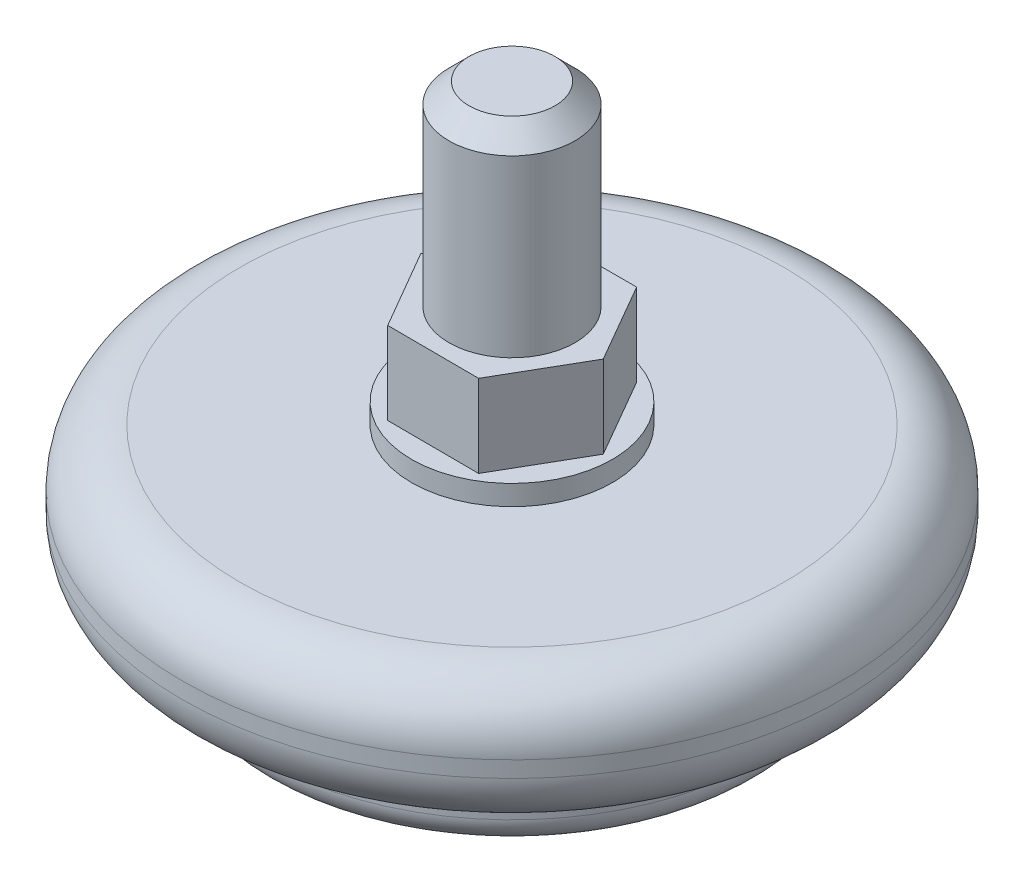
ISO-10303-21;
HEADER;
FILE_DESCRIPTION(('STEP AP214'),'2;1');
FILE_NAME('part.step','',(''),(''),'','','');
FILE_SCHEMA(('AUTOMOTIVE_DESIGN { 1 0 10303 214 1 1 1 1 }'));
ENDSEC;
DATA;
#1=APPLICATION_CONTEXT('core data for automotive mechanical design processes');
#2=APPLICATION_PROTOCOL_DEFINITION('international standard','automotive_design',2000,#1);
#3=PRODUCT_CONTEXT('',#1,'mechanical');
#4=PRODUCT('Part','Part','',(#3));
#5=PRODUCT_RELATED_PRODUCT_CATEGORY('part','',(#4));
#6=PRODUCT_DEFINITION_FORMATION('','',#4);
#7=PRODUCT_DEFINITION_CONTEXT('part definition',#1,'design');
#8=PRODUCT_DEFINITION('design','',#6,#7);
#9=PRODUCT_DEFINITION_SHAPE('','',#8);
#10=(LENGTH_UNIT() NAMED_UNIT(*) SI_UNIT(.MILLI.,.METRE.));
#11=(NAMED_UNIT(*) PLANE_ANGLE_UNIT() SI_UNIT($,.RADIAN.));
#12=(NAMED_UNIT(*) SI_UNIT($,.STERADIAN.) SOLID_ANGLE_UNIT());
#13=UNCERTAINTY_MEASURE_WITH_UNIT(LENGTH_MEASURE(1.E-05),#10,'distance_accuracy_value','');
#14=(GEOMETRIC_REPRESENTATION_CONTEXT(3) GLOBAL_UNCERTAINTY_ASSIGNED_CONTEXT((#13)) GLOBAL_UNIT_ASSIGNED_CONTEXT((#10,
#11,#12)) REPRESENTATION_CONTEXT('',''));
#15=CARTESIAN_POINT('',(0.,0.,0.));
#16=DIRECTION('',(0.,0.,1.));
#17=DIRECTION('',(1.,0.,0.));
#18=AXIS2_PLACEMENT_3D('',#15,#16,#17);
#19=CARTESIAN_POINT('',(26.1069531141512,-14.097,0.));
#20=DIRECTION('',(0.,1.,0.));
#21=DIRECTION('',(0.,0.,1.));
#22=AXIS2_PLACEMENT_3D('',#19,#20,#21);
#23=TOROIDAL_SURFACE('',#22,16.7332577265497,2.03199999999996);
#24=CARTESIAN_POINT('',(26.1069531141512,-16.129,0.));
#25=DIRECTION('',(0.,1.,0.));
#26=DIRECTION('',(0.,0.,1.));
#27=AXIS2_PLACEMENT_3D('',#24,#25,#26);
#28=CIRCLE('',#27,16.7332577265497);
#29=CARTESIAN_POINT('',(26.1069531141512,-16.129,16.7332577265497));
#30=VERTEX_POINT('',#29);
#31=EDGE_CURVE('E13',#30,#30,#28,.T.);
#32=ORIENTED_EDGE('',*,*,#31,.T.);
#33=EDGE_LOOP('',(#32));
#34=FACE_BOUND('',#33,.T.);
#35=CARTESIAN_POINT('',(26.1069531141512,-14.097,0.));
#36=DIRECTION('',(0.,1.,0.));
#37=DIRECTION('',(0.,0.,1.));
#38=AXIS2_PLACEMENT_3D('',#35,#36,#37);
#39=CIRCLE('',#38,18.7652577265496);
#40=CARTESIAN_POINT('',(26.1069531141512,-14.097,18.7652577265496));
#41=VERTEX_POINT('',#40);
#42=EDGE_CURVE('E184',#41,#41,#39,.T.);
#43=ORIENTED_EDGE('',*,*,#42,.F.);
#44=EDGE_LOOP('',(#43));
#45=FACE_BOUND('',#44,.T.);
#46=ADVANCED_FACE('F77',(#34,#45),#23,.T.);
#47=CARTESIAN_POINT('',(9.37369538760147,-16.129,0.));
#48=DIRECTION('',(0.,-1.,0.));
#49=DIRECTION('',(0.,0.,-1.));
#50=AXIS2_PLACEMENT_3D('',#47,#48,#49);
#51=PLANE('',#50);
#52=ORIENTED_EDGE('',*,*,#31,.F.);
#53=EDGE_LOOP('',(#52));
#54=FACE_BOUND('',#53,.T.);
#55=ADVANCED_FACE('F249',(#54),#51,.T.);
#56=CARTESIAN_POINT('',(18.5253048492068,0.,0.));
#57=DIRECTION('',(0.,1.,0.));
#58=DIRECTION('',(0.,0.,1.));
#59=AXIS2_PLACEMENT_3D('',#56,#57,#58);
#60=PLANE('',#59);
#61=CARTESIAN_POINT('',(26.1069531141512,0.,0.));
#62=DIRECTION('',(0.,1.,0.));
#63=DIRECTION('',(0.,0.,1.));
#64=AXIS2_PLACEMENT_3D('',#61,#62,#63);
#65=CIRCLE('',#64,7.5816482649444);
#66=CARTESIAN_POINT('',(26.1069531141512,0.,7.5816482649444));
#67=VERTEX_POINT('',#66);
#68=EDGE_CURVE('E216',#67,#67,#65,.T.);
#69=ORIENTED_EDGE('',*,*,#68,.T.);
#70=EDGE_LOOP('',(#69));
#71=FACE_BOUND('',#70,.T.);
#72=DIRECTION('',(0.501929063563417,0.,0.864908790075781));
#73=VECTOR('',#72,1.);
#74=CARTESIAN_POINT('',(17.0952088213918,0.,-3.6519762303156));
#75=LINE('',#74,#73);
#76=CARTESIAN_POINT('',(19.2145456005653,0.,1.90819582357449E-13));
#77=VERTEX_POINT('',#76);
#78=CARTESIAN_POINT('',(22.6607493573581,0.,5.93839276905226));
#79=VERTEX_POINT('',#78);
#80=EDGE_CURVE('E181',#77,#79,#75,.T.);
#81=ORIENTED_EDGE('',*,*,#80,.F.);
#82=DIRECTION('',(-0.499999999999979,0.,0.866025403784451));
#83=VECTOR('',#82,1.);
#84=CARTESIAN_POINT('',(17.1114680074306,0.,3.64263724356946));
#85=LINE('',#84,#83);
#86=CARTESIAN_POINT('',(22.6607493573584,0.,-5.969));
#87=VERTEX_POINT('',#86);
#88=EDGE_CURVE('E185',#87,#77,#85,.T.);
#89=ORIENTED_EDGE('',*,*,#88,.F.);
#90=DIRECTION('',(-1.,0.,0.));
#91=VECTOR('',#90,1.);
#92=CARTESIAN_POINT('',(10.8022352280253,0.,-5.969));
#93=LINE('',#92,#91);
#94=CARTESIAN_POINT('',(29.553156870944,0.,-5.969));
#95=VERTEX_POINT('',#94);
#96=EDGE_CURVE('E178',#95,#87,#93,.T.);
#97=ORIENTED_EDGE('',*,*,#96,.F.);
#98=DIRECTION('',(-0.499999999999979,0.,-0.866025403784451));
#99=VECTOR('',#98,1.);
#100=CARTESIAN_POINT('',(27.4500792778095,0.,-9.61163724356927));
#101=LINE('',#100,#99);
#102=CARTESIAN_POINT('',(32.9993606277369,0.,0.));
#103=VERTEX_POINT('',#102);
#104=EDGE_CURVE('E157',#103,#95,#101,.T.);
#105=ORIENTED_EDGE('',*,*,#104,.F.);
#106=DIRECTION('',(-0.499999999999987,0.,0.866025403784446));
#107=VECTOR('',#106,1.);
#108=CARTESIAN_POINT('',(27.4500792778093,0.,9.61163724356937));
#109=LINE('',#108,#107);
#110=CARTESIAN_POINT('',(29.5531568709442,0.,5.96899999999987));
#111=VERTEX_POINT('',#110);
#112=EDGE_CURVE('E154',#103,#111,#109,.T.);
#113=ORIENTED_EDGE('',*,*,#112,.T.);
#114=DIRECTION('',(-0.999990140162263,0.,-0.00444067317623687));
#115=VECTOR('',#114,1.);
#116=CARTESIAN_POINT('',(10.7760988714517,0.,5.88561640006411));
#117=LINE('',#116,#115);
#118=EDGE_CURVE('E141',#111,#79,#117,.T.);
#119=ORIENTED_EDGE('',*,*,#118,.T.);
#120=EDGE_LOOP('',(#81,#89,#97,#105,#113,#119));
#121=FACE_BOUND('',#120,.T.);
#122=ADVANCED_FACE('F155',(#71,#121),#60,.T.);
#123=CARTESIAN_POINT('',(26.1069531141512,20.955,0.));
#124=DIRECTION('',(0.,1.,0.));
#125=DIRECTION('',(0.,0.,1.));
#126=AXIS2_PLACEMENT_3D('',#123,#124,#125);
#127=CYLINDRICAL_SURFACE('',#126,7.5816482649444);
#128=CARTESIAN_POINT('',(26.1069531141512,-1.524,0.));
#129=DIRECTION('',(0.,1.,0.));
#130=DIRECTION('',(0.,0.,1.));
#131=AXIS2_PLACEMENT_3D('',#128,#129,#130);
#132=CIRCLE('',#131,7.5816482649444);
#133=CARTESIAN_POINT('',(26.1069531141512,-1.524,7.5816482649444));
#134=VERTEX_POINT('',#133);
#135=EDGE_CURVE('E212',#134,#134,#132,.T.);
#136=ORIENTED_EDGE('',*,*,#135,.T.);
#137=EDGE_LOOP('',(#136));
#138=FACE_BOUND('',#137,.T.);
#139=ORIENTED_EDGE('',*,*,#68,.F.);
#140=EDGE_LOOP('',(#139));
#141=FACE_BOUND('',#140,.T.);
#142=ADVANCED_FACE('F293',(#138,#141),#127,.T.);
#143=CARTESIAN_POINT('',(5.53295311415114,-1.524,0.));
#144=DIRECTION('',(0.,1.,0.));
#145=DIRECTION('',(0.,0.,1.));
#146=AXIS2_PLACEMENT_3D('',#143,#144,#145);
#147=PLANE('',#146);
#148=CARTESIAN_POINT('',(26.1069531141512,-1.524,0.));
#149=DIRECTION('',(0.,1.,0.));
#150=DIRECTION('',(0.,0.,1.));
#151=AXIS2_PLACEMENT_3D('',#148,#149,#150);
#152=CIRCLE('',#151,20.574);
#153=CARTESIAN_POINT('',(26.1069531141512,-1.524,20.574));
#154=VERTEX_POINT('',#153);
#155=EDGE_CURVE('E208',#154,#154,#152,.T.);
#156=ORIENTED_EDGE('',*,*,#155,.T.);
#157=EDGE_LOOP('',(#156));
#158=FACE_BOUND('',#157,.T.);
#159=ORIENTED_EDGE('',*,*,#135,.F.);
#160=EDGE_LOOP('',(#159));
#161=FACE_BOUND('',#160,.T.);
#162=ADVANCED_FACE('F287',(#158,#161),#147,.T.);
#163=CARTESIAN_POINT('',(26.1069531141512,-5.84199999999999,0.));
#164=DIRECTION('',(0.,1.,0.));
#165=DIRECTION('',(0.,0.,1.));
#166=AXIS2_PLACEMENT_3D('',#163,#164,#165);
#167=TOROIDAL_SURFACE('',#166,20.574,4.31800000000004);
#168=CARTESIAN_POINT('',(26.1069531141512,-5.84199999999999,0.));
#169=DIRECTION('',(0.,1.,0.));
#170=DIRECTION('',(0.,0.,1.));
#171=AXIS2_PLACEMENT_3D('',#168,#169,#170);
#172=CIRCLE('',#171,24.8920000000001);
#173=CARTESIAN_POINT('',(26.1069531141512,-5.84199999999999,24.8920000000001));
#174=VERTEX_POINT('',#173);
#175=EDGE_CURVE('E204',#174,#174,#172,.T.);
#176=ORIENTED_EDGE('',*,*,#175,.T.);
#177=EDGE_LOOP('',(#176));
#178=FACE_BOUND('',#177,.T.);
#179=ORIENTED_EDGE('',*,*,#155,.F.);
#180=EDGE_LOOP('',(#179));
#181=FACE_BOUND('',#180,.T.);
#182=ADVANCED_FACE('F281',(#178,#181),#167,.T.);
#183=CARTESIAN_POINT('',(26.1069531141512,20.955,0.));
#184=DIRECTION('',(0.,1.,0.));
#185=DIRECTION('',(0.,0.,1.));
#186=AXIS2_PLACEMENT_3D('',#183,#184,#185);
#187=CYLINDRICAL_SURFACE('',#186,24.8920000000001);
#188=CARTESIAN_POINT('',(26.1069531141512,-7.06119999999999,0.));
#189=DIRECTION('',(0.,1.,0.));
#190=DIRECTION('',(0.,0.,1.));
#191=AXIS2_PLACEMENT_3D('',#188,#189,#190);
#192=CIRCLE('',#191,24.8920000000001);
#193=CARTESIAN_POINT('',(26.1069531141512,-7.06119999999999,24.8920000000001));
#194=VERTEX_POINT('',#193);
#195=EDGE_CURVE('E200',#194,#194,#192,.T.);
#196=ORIENTED_EDGE('',*,*,#195,.T.);
#197=EDGE_LOOP('',(#196));
#198=FACE_BOUND('',#197,.T.);
#199=ORIENTED_EDGE('',*,*,#175,.F.);
#200=EDGE_LOOP('',(#199));
#201=FACE_BOUND('',#200,.T.);
#202=ADVANCED_FACE('F275',(#198,#201),#187,.T.);
#203=CARTESIAN_POINT('',(26.1069531141512,-7.06119999999999,0.));
#204=DIRECTION('',(0.,1.,0.));
#205=DIRECTION('',(0.,0.,1.));
#206=AXIS2_PLACEMENT_3D('',#203,#204,#205);
#207=TOROIDAL_SURFACE('',#206,20.574,4.31800000000005);
#208=CARTESIAN_POINT('',(26.1069531141512,-11.3792,0.));
#209=DIRECTION('',(0.,1.,0.));
#210=DIRECTION('',(0.,0.,1.));
#211=AXIS2_PLACEMENT_3D('',#208,#209,#210);
#212=CIRCLE('',#211,20.574);
#213=CARTESIAN_POINT('',(26.1069531141512,-11.3792,20.574));
#214=VERTEX_POINT('',#213);
#215=EDGE_CURVE('E196',#214,#214,#212,.T.);
#216=ORIENTED_EDGE('',*,*,#215,.T.);
#217=EDGE_LOOP('',(#216));
#218=FACE_BOUND('',#217,.T.);
#219=ORIENTED_EDGE('',*,*,#195,.F.);
#220=EDGE_LOOP('',(#219));
#221=FACE_BOUND('',#220,.T.);
#222=ADVANCED_FACE('F269',(#218,#221),#207,.T.);
#223=CARTESIAN_POINT('',(5.53295311415114,-11.3792,0.));
#224=DIRECTION('',(0.,-1.,0.));
#225=DIRECTION('',(0.,0.,-1.));
#226=AXIS2_PLACEMENT_3D('',#223,#224,#225);
#227=PLANE('',#226);
#228=CARTESIAN_POINT('',(26.1069531141512,-11.3792,0.));
#229=DIRECTION('',(0.,1.,0.));
#230=DIRECTION('',(0.,0.,1.));
#231=AXIS2_PLACEMENT_3D('',#228,#229,#230);
#232=CIRCLE('',#231,18.7652577265497);
#233=CARTESIAN_POINT('',(26.1069531141512,-11.3792,18.7652577265497));
#234=VERTEX_POINT('',#233);
#235=EDGE_CURVE('E192',#234,#234,#232,.T.);
#236=ORIENTED_EDGE('',*,*,#235,.T.);
#237=EDGE_LOOP('',(#236));
#238=FACE_BOUND('',#237,.T.);
#239=ORIENTED_EDGE('',*,*,#215,.F.);
#240=EDGE_LOOP('',(#239));
#241=FACE_BOUND('',#240,.T.);
#242=ADVANCED_FACE('F263',(#238,#241),#227,.T.);
#243=CARTESIAN_POINT('',(26.1069531141512,20.955,0.));
#244=DIRECTION('',(0.,1.,0.));
#245=DIRECTION('',(0.,0.,1.));
#246=AXIS2_PLACEMENT_3D('',#243,#244,#245);
#247=CYLINDRICAL_SURFACE('',#246,18.7652577265497);
#248=ORIENTED_EDGE('',*,*,#42,.T.);
#249=EDGE_LOOP('',(#248));
#250=FACE_BOUND('',#249,.T.);
#251=ORIENTED_EDGE('',*,*,#235,.F.);
#252=EDGE_LOOP('',(#251));
#253=FACE_BOUND('',#252,.T.);
#254=ADVANCED_FACE('F259',(#250,#253),#247,.T.);
#255=CARTESIAN_POINT('',(27.4500792778095,-71.1092600690744,-9.61163724356927));
#256=DIRECTION('',(-0.866025403784451,0.,0.499999999999979));
#257=DIRECTION('',(0.499999999999979,0.,0.866025403784451));
#258=AXIS2_PLACEMENT_3D('',#255,#256,#257);
#259=PLANE('',#258);
#260=ORIENTED_EDGE('',*,*,#104,.T.);
#261=DIRECTION('',(0.,1.,0.));
#262=VECTOR('',#261,1.);
#263=CARTESIAN_POINT('',(29.553156870944,-71.1092600690744,-5.969));
#264=LINE('',#263,#262);
#265=CARTESIAN_POINT('',(29.553156870944,6.22300000000001,-5.969));
#266=VERTEX_POINT('',#265);
#267=EDGE_CURVE('E179',#95,#266,#264,.T.);
#268=ORIENTED_EDGE('',*,*,#267,.T.);
#269=DIRECTION('',(0.499999999999979,0.,0.866025403784451));
#270=VECTOR('',#269,1.);
#271=CARTESIAN_POINT('',(27.4500792778095,6.22300000000001,-9.61163724356927));
#272=LINE('',#271,#270);
#273=CARTESIAN_POINT('',(32.9993606277369,6.22300000000001,0.));
#274=VERTEX_POINT('',#273);
#275=EDGE_CURVE('E315',#266,#274,#272,.T.);
#276=ORIENTED_EDGE('',*,*,#275,.T.);
#277=DIRECTION('',(0.,1.,0.));
#278=VECTOR('',#277,1.);
#279=CARTESIAN_POINT('',(32.9993606277369,-71.1092600690744,0.));
#280=LINE('',#279,#278);
#281=EDGE_CURVE('E161',#103,#274,#280,.T.);
#282=ORIENTED_EDGE('',*,*,#281,.F.);
#283=EDGE_LOOP('',(#260,#268,#276,#282));
#284=FACE_BOUND('',#283,.T.);
#285=ADVANCED_FACE('F262',(#284),#259,.F.);
#286=CARTESIAN_POINT('',(27.4500792778093,-71.1092600690744,9.61163724356937));
#287=DIRECTION('',(0.866025403784446,0.,0.499999999999987));
#288=DIRECTION('',(0.499999999999987,0.,-0.866025403784446));
#289=AXIS2_PLACEMENT_3D('',#286,#287,#288);
#290=PLANE('',#289);
#291=ORIENTED_EDGE('',*,*,#281,.T.);
#292=DIRECTION('',(0.499999999999987,0.,-0.866025403784446));
#293=VECTOR('',#292,1.);
#294=CARTESIAN_POINT('',(27.4500792778093,6.22300000000001,9.61163724356937));
#295=LINE('',#294,#293);
#296=CARTESIAN_POINT('',(29.5531568709442,6.22300000000001,5.96899999999987));
#297=VERTEX_POINT('',#296);
#298=EDGE_CURVE('E151',#297,#274,#295,.T.);
#299=ORIENTED_EDGE('',*,*,#298,.F.);
#300=DIRECTION('',(0.,1.,0.));
#301=VECTOR('',#300,1.);
#302=CARTESIAN_POINT('',(29.5531568709442,-71.1092600690744,5.96899999999987));
#303=LINE('',#302,#301);
#304=EDGE_CURVE('E146',#111,#297,#303,.T.);
#305=ORIENTED_EDGE('',*,*,#304,.F.);
#306=ORIENTED_EDGE('',*,*,#112,.F.);
#307=EDGE_LOOP('',(#291,#299,#305,#306));
#308=FACE_BOUND('',#307,.T.);
#309=ADVANCED_FACE('F163',(#308),#290,.T.);
#310=CARTESIAN_POINT('',(10.7760988714517,-71.1092600690744,5.88561640006411));
#311=DIRECTION('',(-0.00444067317623687,0.,0.999990140162263));
#312=DIRECTION('',(0.999990140162263,0.,0.00444067317623687));
#313=AXIS2_PLACEMENT_3D('',#310,#311,#312);
#314=PLANE('',#313);
#315=ORIENTED_EDGE('',*,*,#304,.T.);
#316=DIRECTION('',(0.999990140162263,0.,0.00444067317623687));
#317=VECTOR('',#316,1.);
#318=CARTESIAN_POINT('',(10.7760988714517,6.22300000000001,5.88561640006411));
#319=LINE('',#318,#317);
#320=CARTESIAN_POINT('',(22.6607493573581,6.22300000000001,5.93839276905226));
#321=VERTEX_POINT('',#320);
#322=EDGE_CURVE('E334',#321,#297,#319,.T.);
#323=ORIENTED_EDGE('',*,*,#322,.F.);
#324=DIRECTION('',(0.,1.,0.));
#325=VECTOR('',#324,1.);
#326=CARTESIAN_POINT('',(22.6607493573581,-71.1092600690744,5.93839276905226));
#327=LINE('',#326,#325);
#328=EDGE_CURVE('E148',#79,#321,#327,.T.);
#329=ORIENTED_EDGE('',*,*,#328,.F.);
#330=ORIENTED_EDGE('',*,*,#118,.F.);
#331=EDGE_LOOP('',(#315,#323,#329,#330));
#332=FACE_BOUND('',#331,.T.);
#333=ADVANCED_FACE('F143',(#332),#314,.T.);
#334=CARTESIAN_POINT('',(17.0952088213918,-71.1092600690744,-3.6519762303156));
#335=DIRECTION('',(0.864908790075781,0.,-0.501929063563417));
#336=DIRECTION('',(-0.501929063563417,0.,-0.864908790075781));
#337=AXIS2_PLACEMENT_3D('',#334,#335,#336);
#338=PLANE('',#337);
#339=ORIENTED_EDGE('',*,*,#80,.T.);
#340=ORIENTED_EDGE('',*,*,#328,.T.);
#341=DIRECTION('',(-0.501929063563417,0.,-0.864908790075781));
#342=VECTOR('',#341,1.);
#343=CARTESIAN_POINT('',(17.0952088213918,6.22300000000001,-3.6519762303156));
#344=LINE('',#343,#342);
#345=CARTESIAN_POINT('',(19.2145456005655,6.22300000000001,0.));
#346=VERTEX_POINT('',#345);
#347=EDGE_CURVE('E323',#321,#346,#344,.T.);
#348=ORIENTED_EDGE('',*,*,#347,.T.);
#349=DIRECTION('',(0.,1.,0.));
#350=VECTOR('',#349,1.);
#351=CARTESIAN_POINT('',(19.2145456005655,-71.1092600690744,0.));
#352=LINE('',#351,#350);
#353=EDGE_CURVE('E104',#77,#346,#352,.T.);
#354=ORIENTED_EDGE('',*,*,#353,.F.);
#355=EDGE_LOOP('',(#339,#340,#348,#354));
#356=FACE_BOUND('',#355,.T.);
#357=ADVANCED_FACE('F346',(#356),#338,.F.);
#358=CARTESIAN_POINT('',(17.1114680074306,-71.1092600690744,3.64263724356946));
#359=DIRECTION('',(0.866025403784451,0.,0.499999999999979));
#360=DIRECTION('',(0.499999999999979,0.,-0.866025403784451));
#361=AXIS2_PLACEMENT_3D('',#358,#359,#360);
#362=PLANE('',#361);
#363=ORIENTED_EDGE('',*,*,#88,.T.);
#364=ORIENTED_EDGE('',*,*,#353,.T.);
#365=DIRECTION('',(0.499999999999979,0.,-0.866025403784451));
#366=VECTOR('',#365,1.);
#367=CARTESIAN_POINT('',(17.1114680074306,6.22300000000001,3.64263724356946));
#368=LINE('',#367,#366);
#369=CARTESIAN_POINT('',(22.6607493573583,6.22300000000001,-5.96899999999995));
#370=VERTEX_POINT('',#369);
#371=EDGE_CURVE('E95',#346,#370,#368,.T.);
#372=ORIENTED_EDGE('',*,*,#371,.T.);
#373=DIRECTION('',(0.,1.,0.));
#374=VECTOR('',#373,1.);
#375=CARTESIAN_POINT('',(22.6607493573584,-71.1092600690744,-5.969));
#376=LINE('',#375,#374);
#377=EDGE_CURVE('E339',#87,#370,#376,.T.);
#378=ORIENTED_EDGE('',*,*,#377,.F.);
#379=EDGE_LOOP('',(#363,#364,#372,#378));
#380=FACE_BOUND('',#379,.T.);
#381=ADVANCED_FACE('F343',(#380),#362,.F.);
#382=CARTESIAN_POINT('',(10.8022352280253,-71.1092600690744,-5.969));
#383=DIRECTION('',(0.,0.,1.));
#384=DIRECTION('',(1.,0.,0.));
#385=AXIS2_PLACEMENT_3D('',#382,#383,#384);
#386=PLANE('',#385);
#387=ORIENTED_EDGE('',*,*,#96,.T.);
#388=ORIENTED_EDGE('',*,*,#377,.T.);
#389=DIRECTION('',(1.,0.,0.));
#390=VECTOR('',#389,1.);
#391=CARTESIAN_POINT('',(10.8022352280253,6.22300000000001,-5.969));
#392=LINE('',#391,#390);
#393=EDGE_CURVE('E320',#370,#266,#392,.T.);
#394=ORIENTED_EDGE('',*,*,#393,.T.);
#395=ORIENTED_EDGE('',*,*,#267,.F.);
#396=EDGE_LOOP('',(#387,#388,#394,#395));
#397=FACE_BOUND('',#396,.T.);
#398=ADVANCED_FACE('F246',(#397),#386,.F.);
#399=CARTESIAN_POINT('',(26.1069531141512,20.955,0.));
#400=DIRECTION('',(0.,1.,0.));
#401=DIRECTION('',(0.,0.,1.));
#402=AXIS2_PLACEMENT_3D('',#399,#400,#401);
#403=PLANE('',#402);
#404=CARTESIAN_POINT('',(26.1069531141512,20.955,0.));
#405=DIRECTION('',(0.,1.,0.));
#406=DIRECTION('',(0.,0.,1.));
#407=AXIS2_PLACEMENT_3D('',#404,#405,#406);
#408=CIRCLE('',#407,3.23849999999998);
#409=CARTESIAN_POINT('',(26.1069531141512,20.955,3.23849999999998));
#410=VERTEX_POINT('',#409);
#411=EDGE_CURVE('E85',#410,#410,#408,.T.);
#412=ORIENTED_EDGE('',*,*,#411,.T.);
#413=EDGE_LOOP('',(#412));
#414=FACE_BOUND('',#413,.T.);
#415=ADVANCED_FACE('F232',(#414),#403,.T.);
#416=CARTESIAN_POINT('',(26.1069531141512,20.955,0.));
#417=DIRECTION('',(0.,-1.,0.));
#418=DIRECTION('',(0.,0.,-1.));
#419=AXIS2_PLACEMENT_3D('',#416,#417,#418);
#420=CONICAL_SURFACE('',#419,3.23849999999998,0.785398163397476);
#421=CARTESIAN_POINT('',(26.1069531141512,19.431,0.));
#422=DIRECTION('',(0.,1.,0.));
#423=DIRECTION('',(0.,0.,1.));
#424=AXIS2_PLACEMENT_3D('',#421,#422,#423);
#425=CIRCLE('',#424,4.76250000000006);
#426=CARTESIAN_POINT('',(26.1069531141512,19.431,4.76250000000006));
#427=VERTEX_POINT('',#426);
#428=EDGE_CURVE('E224',#427,#427,#425,.T.);
#429=ORIENTED_EDGE('',*,*,#428,.T.);
#430=EDGE_LOOP('',(#429));
#431=FACE_BOUND('',#430,.T.);
#432=ORIENTED_EDGE('',*,*,#411,.F.);
#433=EDGE_LOOP('',(#432));
#434=FACE_BOUND('',#433,.T.);
#435=ADVANCED_FACE('F234',(#431,#434),#420,.T.);
#436=CARTESIAN_POINT('',(26.1069531141512,20.955,0.));
#437=DIRECTION('',(0.,1.,0.));
#438=DIRECTION('',(0.,0.,1.));
#439=AXIS2_PLACEMENT_3D('',#436,#437,#438);
#440=CYLINDRICAL_SURFACE('',#439,4.76250000000006);
#441=CARTESIAN_POINT('',(26.1069531141512,6.22300000000001,0.));
#442=DIRECTION('',(0.,1.,0.));
#443=DIRECTION('',(0.,0.,1.));
#444=AXIS2_PLACEMENT_3D('',#441,#442,#443);
#445=CIRCLE('',#444,4.76250000000006);
#446=CARTESIAN_POINT('',(26.1069531141512,6.22300000000001,4.76250000000006));
#447=VERTEX_POINT('',#446);
#448=EDGE_CURVE('E220',#447,#447,#445,.T.);
#449=ORIENTED_EDGE('',*,*,#448,.T.);
#450=EDGE_LOOP('',(#449));
#451=FACE_BOUND('',#450,.T.);
#452=ORIENTED_EDGE('',*,*,#428,.F.);
#453=EDGE_LOOP('',(#452));
#454=FACE_BOUND('',#453,.T.);
#455=ADVANCED_FACE('F236',(#451,#454),#440,.T.);
#456=CARTESIAN_POINT('',(19.2145456005655,6.22300000000001,0.));
#457=DIRECTION('',(0.,1.,0.));
#458=DIRECTION('',(0.,0.,1.));
#459=AXIS2_PLACEMENT_3D('',#456,#457,#458);
#460=PLANE('',#459);
#461=ORIENTED_EDGE('',*,*,#275,.F.);
#462=ORIENTED_EDGE('',*,*,#393,.F.);
#463=ORIENTED_EDGE('',*,*,#371,.F.);
#464=ORIENTED_EDGE('',*,*,#347,.F.);
#465=ORIENTED_EDGE('',*,*,#322,.T.);
#466=ORIENTED_EDGE('',*,*,#298,.T.);
#467=EDGE_LOOP('',(#461,#462,#463,#464,#465,#466));
#468=FACE_BOUND('',#467,.T.);
#469=ORIENTED_EDGE('',*,*,#448,.F.);
#470=EDGE_LOOP('',(#469));
#471=FACE_BOUND('',#470,.T.);
#472=ADVANCED_FACE('F243',(#468,#471),#460,.T.);
#473=CLOSED_SHELL('',(#46,#55,#122,#142,#162,#182,#202,#222,#242,#254,#285,#309,#333,#357,#381,
#398,#415,#435,#455,#472));
#474=MANIFOLD_SOLID_BREP('B2',#473);
#475=ADVANCED_BREP_SHAPE_REPRESENTATION('',(#18,#474),#14);
#476=SHAPE_DEFINITION_REPRESENTATION(#9,#475);
ENDSEC;
END-ISO-10303-21;
